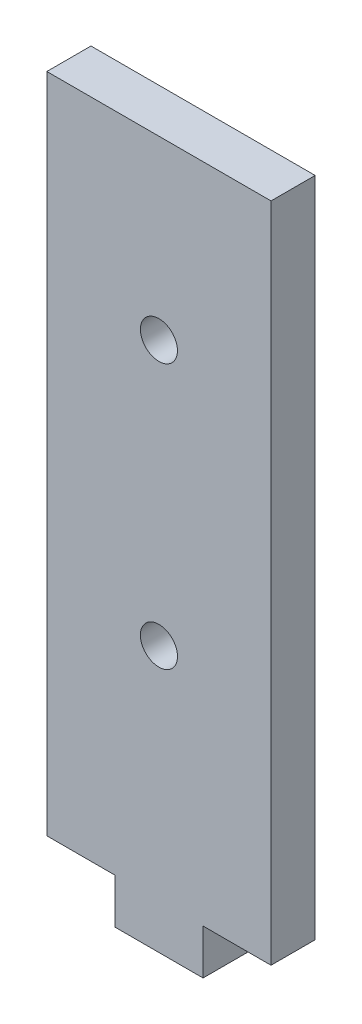
ISO-10303-21;
HEADER;
FILE_DESCRIPTION(('STEP AP214'),'2;1');
FILE_NAME('part.step','',(''),(''),'','','');
FILE_SCHEMA(('AUTOMOTIVE_DESIGN { 1 0 10303 214 1 1 1 1 }'));
ENDSEC;
DATA;
#1=APPLICATION_CONTEXT('core data for automotive mechanical design processes');
#2=APPLICATION_PROTOCOL_DEFINITION('international standard','automotive_design',2000,#1);
#3=PRODUCT_CONTEXT('',#1,'mechanical');
#4=PRODUCT('Part','Part','',(#3));
#5=PRODUCT_RELATED_PRODUCT_CATEGORY('part','',(#4));
#6=PRODUCT_DEFINITION_FORMATION('','',#4);
#7=PRODUCT_DEFINITION_CONTEXT('part definition',#1,'design');
#8=PRODUCT_DEFINITION('design','',#6,#7);
#9=PRODUCT_DEFINITION_SHAPE('','',#8);
#10=(LENGTH_UNIT() NAMED_UNIT(*) SI_UNIT(.MILLI.,.METRE.));
#11=(NAMED_UNIT(*) PLANE_ANGLE_UNIT() SI_UNIT($,.RADIAN.));
#12=(NAMED_UNIT(*) SI_UNIT($,.STERADIAN.) SOLID_ANGLE_UNIT());
#13=UNCERTAINTY_MEASURE_WITH_UNIT(LENGTH_MEASURE(1.E-05),#10,'distance_accuracy_value','');
#14=(GEOMETRIC_REPRESENTATION_CONTEXT(3) GLOBAL_UNCERTAINTY_ASSIGNED_CONTEXT((#13)) GLOBAL_UNIT_ASSIGNED_CONTEXT((#10,
#11,#12)) REPRESENTATION_CONTEXT('',''));
#15=CARTESIAN_POINT('',(0.,0.,0.));
#16=DIRECTION('',(0.,0.,1.));
#17=DIRECTION('',(1.,0.,0.));
#18=AXIS2_PLACEMENT_3D('',#15,#16,#17);
#19=CARTESIAN_POINT('',(-12.7,-37.5,5.));
#20=DIRECTION('',(0.,1.,0.));
#21=DIRECTION('',(0.,0.,1.));
#22=AXIS2_PLACEMENT_3D('',#19,#20,#21);
#23=PLANE('',#22);
#24=DIRECTION('',(1.,0.,0.));
#25=VECTOR('',#24,1.);
#26=CARTESIAN_POINT('',(-12.7,-37.5,5.));
#27=LINE('',#26,#25);
#28=CARTESIAN_POINT('',(4.99999999999999,-37.5,5.));
#29=VERTEX_POINT('',#28);
#30=CARTESIAN_POINT('',(12.7,-37.5,5.));
#31=VERTEX_POINT('',#30);
#32=EDGE_CURVE('E74',#29,#31,#27,.T.);
#33=ORIENTED_EDGE('',*,*,#32,.F.);
#34=DIRECTION('',(0.,0.,-1.));
#35=VECTOR('',#34,1.);
#36=CARTESIAN_POINT('',(4.99999999999999,-37.5,5.));
#37=LINE('',#36,#35);
#38=CARTESIAN_POINT('',(5.,-37.5,0.));
#39=VERTEX_POINT('',#38);
#40=EDGE_CURVE('E13',#29,#39,#37,.T.);
#41=ORIENTED_EDGE('',*,*,#40,.T.);
#42=DIRECTION('',(1.,0.,0.));
#43=VECTOR('',#42,1.);
#44=CARTESIAN_POINT('',(-12.7,-37.5,0.));
#45=LINE('',#44,#43);
#46=CARTESIAN_POINT('',(12.7,-37.5,0.));
#47=VERTEX_POINT('',#46);
#48=EDGE_CURVE('E95',#39,#47,#45,.T.);
#49=ORIENTED_EDGE('',*,*,#48,.T.);
#50=DIRECTION('',(0.,0.,-1.));
#51=VECTOR('',#50,1.);
#52=CARTESIAN_POINT('',(12.7,-37.5,5.));
#53=LINE('',#52,#51);
#54=EDGE_CURVE('E194',#31,#47,#53,.T.);
#55=ORIENTED_EDGE('',*,*,#54,.F.);
#56=EDGE_LOOP('',(#33,#41,#49,#55));
#57=FACE_BOUND('',#56,.T.);
#58=ADVANCED_FACE('F52',(#57),#23,.F.);
#59=CARTESIAN_POINT('',(0.,0.,5.));
#60=DIRECTION('',(0.,0.,1.));
#61=DIRECTION('',(1.,0.,0.));
#62=AXIS2_PLACEMENT_3D('',#59,#60,#61);
#63=PLANE('',#62);
#64=CARTESIAN_POINT('',(-12.7,-37.5,5.));
#65=VERTEX_POINT('',#64);
#66=CARTESIAN_POINT('',(-5.,-37.5,5.));
#67=VERTEX_POINT('',#66);
#68=EDGE_CURVE('E190',#65,#67,#27,.T.);
#69=ORIENTED_EDGE('',*,*,#68,.T.);
#70=DIRECTION('',(0.,-1.,0.));
#71=VECTOR('',#70,1.);
#72=CARTESIAN_POINT('',(-5.,-32.4,5.));
#73=LINE('',#72,#71);
#74=CARTESIAN_POINT('',(-5.,-42.6,5.));
#75=VERTEX_POINT('',#74);
#76=EDGE_CURVE('E157',#67,#75,#73,.T.);
#77=ORIENTED_EDGE('',*,*,#76,.T.);
#78=DIRECTION('',(1.,0.,0.));
#79=VECTOR('',#78,1.);
#80=CARTESIAN_POINT('',(-5.,-42.6,5.));
#81=LINE('',#80,#79);
#82=CARTESIAN_POINT('',(5.,-42.6,5.));
#83=VERTEX_POINT('',#82);
#84=EDGE_CURVE('E144',#75,#83,#81,.T.);
#85=ORIENTED_EDGE('',*,*,#84,.T.);
#86=DIRECTION('',(0.,1.,0.));
#87=VECTOR('',#86,1.);
#88=CARTESIAN_POINT('',(5.,-32.4,5.));
#89=LINE('',#88,#87);
#90=EDGE_CURVE('E68',#83,#29,#89,.T.);
#91=ORIENTED_EDGE('',*,*,#90,.T.);
#92=ORIENTED_EDGE('',*,*,#32,.T.);
#93=DIRECTION('',(0.,1.,0.));
#94=VECTOR('',#93,1.);
#95=CARTESIAN_POINT('',(12.7,37.5,5.));
#96=LINE('',#95,#94);
#97=CARTESIAN_POINT('',(12.7,37.5,5.));
#98=VERTEX_POINT('',#97);
#99=EDGE_CURVE('E181',#31,#98,#96,.T.);
#100=ORIENTED_EDGE('',*,*,#99,.T.);
#101=DIRECTION('',(-1.,0.,0.));
#102=VECTOR('',#101,1.);
#103=CARTESIAN_POINT('',(-12.7,37.5,5.));
#104=LINE('',#103,#102);
#105=CARTESIAN_POINT('',(-12.7,37.5,5.));
#106=VERTEX_POINT('',#105);
#107=EDGE_CURVE('E103',#98,#106,#104,.T.);
#108=ORIENTED_EDGE('',*,*,#107,.T.);
#109=DIRECTION('',(0.,-1.,0.));
#110=VECTOR('',#109,1.);
#111=CARTESIAN_POINT('',(-12.7,37.5,5.));
#112=LINE('',#111,#110);
#113=EDGE_CURVE('E187',#106,#65,#112,.T.);
#114=ORIENTED_EDGE('',*,*,#113,.T.);
#115=EDGE_LOOP('',(#69,#77,#85,#91,#92,#100,#108,#114));
#116=FACE_BOUND('',#115,.T.);
#117=CARTESIAN_POINT('',(0.,-12.5,5.));
#118=DIRECTION('',(0.,0.,1.));
#119=DIRECTION('',(1.,0.,0.));
#120=AXIS2_PLACEMENT_3D('',#117,#118,#119);
#121=CIRCLE('',#120,2.1);
#122=CARTESIAN_POINT('',(2.1,-12.5,5.));
#123=VERTEX_POINT('',#122);
#124=EDGE_CURVE('E173',#123,#123,#121,.T.);
#125=ORIENTED_EDGE('',*,*,#124,.F.);
#126=EDGE_LOOP('',(#125));
#127=FACE_BOUND('',#126,.T.);
#128=CARTESIAN_POINT('',(0.,17.5,5.));
#129=DIRECTION('',(0.,0.,1.));
#130=DIRECTION('',(1.,0.,0.));
#131=AXIS2_PLACEMENT_3D('',#128,#129,#130);
#132=CIRCLE('',#131,2.1);
#133=CARTESIAN_POINT('',(2.1,17.5,5.));
#134=VERTEX_POINT('',#133);
#135=EDGE_CURVE('E165',#134,#134,#132,.T.);
#136=ORIENTED_EDGE('',*,*,#135,.F.);
#137=EDGE_LOOP('',(#136));
#138=FACE_BOUND('',#137,.T.);
#139=ADVANCED_FACE('F222',(#116,#127,#138),#63,.T.);
#140=CARTESIAN_POINT('',(0.,0.,0.));
#141=DIRECTION('',(0.,0.,1.));
#142=DIRECTION('',(1.,0.,0.));
#143=AXIS2_PLACEMENT_3D('',#140,#141,#142);
#144=PLANE('',#143);
#145=DIRECTION('',(0.,-1.,0.));
#146=VECTOR('',#145,1.);
#147=CARTESIAN_POINT('',(-5.,-32.4,0.));
#148=LINE('',#147,#146);
#149=CARTESIAN_POINT('',(-5.,-37.5,0.));
#150=VERTEX_POINT('',#149);
#151=CARTESIAN_POINT('',(-5.,-42.6,0.));
#152=VERTEX_POINT('',#151);
#153=EDGE_CURVE('E127',#150,#152,#148,.T.);
#154=ORIENTED_EDGE('',*,*,#153,.F.);
#155=CARTESIAN_POINT('',(-12.7,-37.5,0.));
#156=VERTEX_POINT('',#155);
#157=EDGE_CURVE('E184',#156,#150,#45,.T.);
#158=ORIENTED_EDGE('',*,*,#157,.F.);
#159=DIRECTION('',(0.,-1.,0.));
#160=VECTOR('',#159,1.);
#161=CARTESIAN_POINT('',(-12.7,37.5,0.));
#162=LINE('',#161,#160);
#163=CARTESIAN_POINT('',(-12.7,37.5,0.));
#164=VERTEX_POINT('',#163);
#165=EDGE_CURVE('E201',#164,#156,#162,.T.);
#166=ORIENTED_EDGE('',*,*,#165,.F.);
#167=DIRECTION('',(-1.,0.,0.));
#168=VECTOR('',#167,1.);
#169=CARTESIAN_POINT('',(-12.7,37.5,0.));
#170=LINE('',#169,#168);
#171=CARTESIAN_POINT('',(12.7,37.5,0.));
#172=VERTEX_POINT('',#171);
#173=EDGE_CURVE('E198',#172,#164,#170,.T.);
#174=ORIENTED_EDGE('',*,*,#173,.F.);
#175=DIRECTION('',(0.,1.,0.));
#176=VECTOR('',#175,1.);
#177=CARTESIAN_POINT('',(12.7,37.5,0.));
#178=LINE('',#177,#176);
#179=EDGE_CURVE('E177',#47,#172,#178,.T.);
#180=ORIENTED_EDGE('',*,*,#179,.F.);
#181=ORIENTED_EDGE('',*,*,#48,.F.);
#182=DIRECTION('',(0.,1.,0.));
#183=VECTOR('',#182,1.);
#184=CARTESIAN_POINT('',(5.,-32.4,0.));
#185=LINE('',#184,#183);
#186=CARTESIAN_POINT('',(5.,-42.6,0.));
#187=VERTEX_POINT('',#186);
#188=EDGE_CURVE('E139',#187,#39,#185,.T.);
#189=ORIENTED_EDGE('',*,*,#188,.F.);
#190=DIRECTION('',(1.,0.,0.));
#191=VECTOR('',#190,1.);
#192=CARTESIAN_POINT('',(-5.,-42.6,0.));
#193=LINE('',#192,#191);
#194=EDGE_CURVE('E138',#152,#187,#193,.T.);
#195=ORIENTED_EDGE('',*,*,#194,.F.);
#196=EDGE_LOOP('',(#154,#158,#166,#174,#180,#181,#189,#195));
#197=FACE_BOUND('',#196,.T.);
#198=CARTESIAN_POINT('',(0.,-12.5,0.));
#199=DIRECTION('',(0.,0.,1.));
#200=DIRECTION('',(1.,0.,0.));
#201=AXIS2_PLACEMENT_3D('',#198,#199,#200);
#202=CIRCLE('',#201,2.1);
#203=CARTESIAN_POINT('',(2.1,-12.5,0.));
#204=VERTEX_POINT('',#203);
#205=EDGE_CURVE('E169',#204,#204,#202,.T.);
#206=ORIENTED_EDGE('',*,*,#205,.T.);
#207=EDGE_LOOP('',(#206));
#208=FACE_BOUND('',#207,.T.);
#209=CARTESIAN_POINT('',(0.,17.5,0.));
#210=DIRECTION('',(0.,0.,1.));
#211=DIRECTION('',(1.,0.,0.));
#212=AXIS2_PLACEMENT_3D('',#209,#210,#211);
#213=CIRCLE('',#212,2.1);
#214=CARTESIAN_POINT('',(2.1,17.5,0.));
#215=VERTEX_POINT('',#214);
#216=EDGE_CURVE('E163',#215,#215,#213,.T.);
#217=ORIENTED_EDGE('',*,*,#216,.T.);
#218=EDGE_LOOP('',(#217));
#219=FACE_BOUND('',#218,.T.);
#220=ADVANCED_FACE('F149',(#197,#208,#219),#144,.F.);
#221=CARTESIAN_POINT('',(12.7,37.5,5.));
#222=DIRECTION('',(-1.,0.,0.));
#223=DIRECTION('',(0.,-1.,0.));
#224=AXIS2_PLACEMENT_3D('',#221,#222,#223);
#225=PLANE('',#224);
#226=ORIENTED_EDGE('',*,*,#179,.T.);
#227=DIRECTION('',(0.,0.,-1.));
#228=VECTOR('',#227,1.);
#229=CARTESIAN_POINT('',(12.7,37.5,5.));
#230=LINE('',#229,#228);
#231=EDGE_CURVE('E216',#98,#172,#230,.T.);
#232=ORIENTED_EDGE('',*,*,#231,.F.);
#233=ORIENTED_EDGE('',*,*,#99,.F.);
#234=ORIENTED_EDGE('',*,*,#54,.T.);
#235=EDGE_LOOP('',(#226,#232,#233,#234));
#236=FACE_BOUND('',#235,.T.);
#237=ADVANCED_FACE('F54',(#236),#225,.F.);
#238=CARTESIAN_POINT('',(-12.7,37.5,5.));
#239=DIRECTION('',(0.,-1.,0.));
#240=DIRECTION('',(0.,0.,-1.));
#241=AXIS2_PLACEMENT_3D('',#238,#239,#240);
#242=PLANE('',#241);
#243=ORIENTED_EDGE('',*,*,#173,.T.);
#244=DIRECTION('',(0.,0.,-1.));
#245=VECTOR('',#244,1.);
#246=CARTESIAN_POINT('',(-12.7,37.5,5.));
#247=LINE('',#246,#245);
#248=EDGE_CURVE('E212',#106,#164,#247,.T.);
#249=ORIENTED_EDGE('',*,*,#248,.F.);
#250=ORIENTED_EDGE('',*,*,#107,.F.);
#251=ORIENTED_EDGE('',*,*,#231,.T.);
#252=EDGE_LOOP('',(#243,#249,#250,#251));
#253=FACE_BOUND('',#252,.T.);
#254=ADVANCED_FACE('F231',(#253),#242,.F.);
#255=CARTESIAN_POINT('',(-12.7,37.5,5.));
#256=DIRECTION('',(1.,0.,0.));
#257=DIRECTION('',(0.,1.,0.));
#258=AXIS2_PLACEMENT_3D('',#255,#256,#257);
#259=PLANE('',#258);
#260=ORIENTED_EDGE('',*,*,#165,.T.);
#261=DIRECTION('',(0.,0.,-1.));
#262=VECTOR('',#261,1.);
#263=CARTESIAN_POINT('',(-12.7,-37.5,5.));
#264=LINE('',#263,#262);
#265=EDGE_CURVE('E208',#65,#156,#264,.T.);
#266=ORIENTED_EDGE('',*,*,#265,.F.);
#267=ORIENTED_EDGE('',*,*,#113,.F.);
#268=ORIENTED_EDGE('',*,*,#248,.T.);
#269=EDGE_LOOP('',(#260,#266,#267,#268));
#270=FACE_BOUND('',#269,.T.);
#271=ADVANCED_FACE('F227',(#270),#259,.F.);
#272=ORIENTED_EDGE('',*,*,#157,.T.);
#273=DIRECTION('',(0.,0.,1.));
#274=VECTOR('',#273,1.);
#275=CARTESIAN_POINT('',(-5.,-37.5,5.));
#276=LINE('',#275,#274);
#277=EDGE_CURVE('E61',#150,#67,#276,.T.);
#278=ORIENTED_EDGE('',*,*,#277,.T.);
#279=ORIENTED_EDGE('',*,*,#68,.F.);
#280=ORIENTED_EDGE('',*,*,#265,.T.);
#281=EDGE_LOOP('',(#272,#278,#279,#280));
#282=FACE_BOUND('',#281,.T.);
#283=ADVANCED_FACE('F221',(#282),#23,.F.);
#284=CARTESIAN_POINT('',(0.,-12.5,5.));
#285=DIRECTION('',(0.,0.,-1.));
#286=DIRECTION('',(-1.,0.,0.));
#287=AXIS2_PLACEMENT_3D('',#284,#285,#286);
#288=CYLINDRICAL_SURFACE('',#287,2.1);
#289=ORIENTED_EDGE('',*,*,#124,.T.);
#290=EDGE_LOOP('',(#289));
#291=FACE_BOUND('',#290,.T.);
#292=ORIENTED_EDGE('',*,*,#205,.F.);
#293=EDGE_LOOP('',(#292));
#294=FACE_BOUND('',#293,.T.);
#295=ADVANCED_FACE('F247',(#291,#294),#288,.F.);
#296=CARTESIAN_POINT('',(0.,17.5,5.));
#297=DIRECTION('',(0.,0.,-1.));
#298=DIRECTION('',(-1.,0.,0.));
#299=AXIS2_PLACEMENT_3D('',#296,#297,#298);
#300=CYLINDRICAL_SURFACE('',#299,2.1);
#301=ORIENTED_EDGE('',*,*,#135,.T.);
#302=EDGE_LOOP('',(#301));
#303=FACE_BOUND('',#302,.T.);
#304=ORIENTED_EDGE('',*,*,#216,.F.);
#305=EDGE_LOOP('',(#304));
#306=FACE_BOUND('',#305,.T.);
#307=ADVANCED_FACE('F240',(#303,#306),#300,.F.);
#308=CARTESIAN_POINT('',(5.,-32.4,0.));
#309=DIRECTION('',(1.,0.,0.));
#310=DIRECTION('',(0.,1.,0.));
#311=AXIS2_PLACEMENT_3D('',#308,#309,#310);
#312=PLANE('',#311);
#313=ORIENTED_EDGE('',*,*,#40,.F.);
#314=ORIENTED_EDGE('',*,*,#90,.F.);
#315=DIRECTION('',(0.,0.,1.));
#316=VECTOR('',#315,1.);
#317=CARTESIAN_POINT('',(5.,-42.6,0.));
#318=LINE('',#317,#316);
#319=EDGE_CURVE('E146',#187,#83,#318,.T.);
#320=ORIENTED_EDGE('',*,*,#319,.F.);
#321=ORIENTED_EDGE('',*,*,#188,.T.);
#322=EDGE_LOOP('',(#313,#314,#320,#321));
#323=FACE_BOUND('',#322,.T.);
#324=ADVANCED_FACE('F238',(#323),#312,.T.);
#325=CARTESIAN_POINT('',(-5.,-32.4,0.));
#326=DIRECTION('',(-1.,0.,0.));
#327=DIRECTION('',(0.,-1.,0.));
#328=AXIS2_PLACEMENT_3D('',#325,#326,#327);
#329=PLANE('',#328);
#330=ORIENTED_EDGE('',*,*,#277,.F.);
#331=ORIENTED_EDGE('',*,*,#153,.T.);
#332=DIRECTION('',(0.,0.,1.));
#333=VECTOR('',#332,1.);
#334=CARTESIAN_POINT('',(-5.,-42.6,0.));
#335=LINE('',#334,#333);
#336=EDGE_CURVE('E130',#152,#75,#335,.T.);
#337=ORIENTED_EDGE('',*,*,#336,.T.);
#338=ORIENTED_EDGE('',*,*,#76,.F.);
#339=EDGE_LOOP('',(#330,#331,#337,#338));
#340=FACE_BOUND('',#339,.T.);
#341=ADVANCED_FACE('F129',(#340),#329,.T.);
#342=CARTESIAN_POINT('',(-5.,-42.6,0.));
#343=DIRECTION('',(0.,-1.,0.));
#344=DIRECTION('',(0.,0.,-1.));
#345=AXIS2_PLACEMENT_3D('',#342,#343,#344);
#346=PLANE('',#345);
#347=ORIENTED_EDGE('',*,*,#84,.F.);
#348=ORIENTED_EDGE('',*,*,#336,.F.);
#349=ORIENTED_EDGE('',*,*,#194,.T.);
#350=ORIENTED_EDGE('',*,*,#319,.T.);
#351=EDGE_LOOP('',(#347,#348,#349,#350));
#352=FACE_BOUND('',#351,.T.);
#353=ADVANCED_FACE('F143',(#352),#346,.T.);
#354=CLOSED_SHELL('',(#58,#139,#220,#237,#254,#271,#283,#295,#307,#324,#341,#353));
#355=MANIFOLD_SOLID_BREP('B2',#354);
#356=ADVANCED_BREP_SHAPE_REPRESENTATION('',(#18,#355),#14);
#357=SHAPE_DEFINITION_REPRESENTATION(#9,#356);
ENDSEC;
END-ISO-10303-21;
